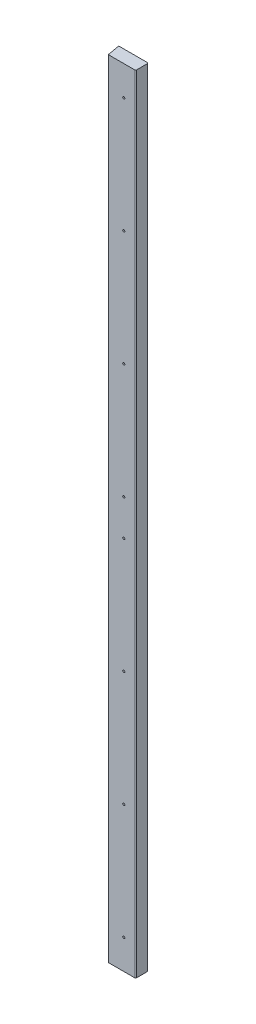
ISO-10303-21;
HEADER;
FILE_DESCRIPTION(('STEP AP214'),'2;1');
FILE_NAME('part.step','',(''),(''),'','','');
FILE_SCHEMA(('AUTOMOTIVE_DESIGN { 1 0 10303 214 1 1 1 1 }'));
ENDSEC;
DATA;
#1=APPLICATION_CONTEXT('core data for automotive mechanical design processes');
#2=APPLICATION_PROTOCOL_DEFINITION('international standard','automotive_design',2000,#1);
#3=PRODUCT_CONTEXT('',#1,'mechanical');
#4=PRODUCT('Part','Part','',(#3));
#5=PRODUCT_RELATED_PRODUCT_CATEGORY('part','',(#4));
#6=PRODUCT_DEFINITION_FORMATION('','',#4);
#7=PRODUCT_DEFINITION_CONTEXT('part definition',#1,'design');
#8=PRODUCT_DEFINITION('design','',#6,#7);
#9=PRODUCT_DEFINITION_SHAPE('','',#8);
#10=(LENGTH_UNIT() NAMED_UNIT(*) SI_UNIT(.MILLI.,.METRE.));
#11=(NAMED_UNIT(*) PLANE_ANGLE_UNIT() SI_UNIT($,.RADIAN.));
#12=(NAMED_UNIT(*) SI_UNIT($,.STERADIAN.) SOLID_ANGLE_UNIT());
#13=UNCERTAINTY_MEASURE_WITH_UNIT(LENGTH_MEASURE(1.E-05),#10,'distance_accuracy_value','');
#14=(GEOMETRIC_REPRESENTATION_CONTEXT(3) GLOBAL_UNCERTAINTY_ASSIGNED_CONTEXT((#13)) GLOBAL_UNIT_ASSIGNED_CONTEXT((#10,
#11,#12)) REPRESENTATION_CONTEXT('',''));
#15=CARTESIAN_POINT('',(0.,0.,0.));
#16=DIRECTION('',(0.,0.,1.));
#17=DIRECTION('',(1.,0.,0.));
#18=AXIS2_PLACEMENT_3D('',#15,#16,#17);
#19=CARTESIAN_POINT('',(44.45,2362.2,-19.05));
#20=DIRECTION('',(-1.,0.,0.));
#21=DIRECTION('',(0.,0.,1.));
#22=AXIS2_PLACEMENT_3D('',#19,#20,#21);
#23=PLANE('',#22);
#24=DIRECTION('',(0.,0.,-1.));
#25=VECTOR('',#24,1.);
#26=CARTESIAN_POINT('',(44.45,2362.2,-19.05));
#27=LINE('',#26,#25);
#28=CARTESIAN_POINT('',(44.45,2362.2,15.875));
#29=VERTEX_POINT('',#28);
#30=CARTESIAN_POINT('',(44.45,2362.2,-15.875));
#31=VERTEX_POINT('',#30);
#32=EDGE_CURVE('E94',#29,#31,#27,.T.);
#33=ORIENTED_EDGE('',*,*,#32,.F.);
#34=DIRECTION('',(0.,-1.,0.));
#35=VECTOR('',#34,1.);
#36=CARTESIAN_POINT('',(44.45,2362.2,15.875));
#37=LINE('',#36,#35);
#38=CARTESIAN_POINT('',(44.45,0.,15.875));
#39=VERTEX_POINT('',#38);
#40=EDGE_CURVE('E124',#29,#39,#37,.T.);
#41=ORIENTED_EDGE('',*,*,#40,.T.);
#42=DIRECTION('',(0.,0.,-1.));
#43=VECTOR('',#42,1.);
#44=CARTESIAN_POINT('',(44.45,0.,-19.05));
#45=LINE('',#44,#43);
#46=CARTESIAN_POINT('',(44.45,0.,-15.875));
#47=VERTEX_POINT('',#46);
#48=EDGE_CURVE('E113',#39,#47,#45,.T.);
#49=ORIENTED_EDGE('',*,*,#48,.T.);
#50=DIRECTION('',(0.,-1.,0.));
#51=VECTOR('',#50,1.);
#52=CARTESIAN_POINT('',(44.45,2362.2,-15.875));
#53=LINE('',#52,#51);
#54=EDGE_CURVE('E103',#47,#31,#53,.F.);
#55=ORIENTED_EDGE('',*,*,#54,.T.);
#56=EDGE_LOOP('',(#33,#41,#49,#55));
#57=FACE_BOUND('',#56,.T.);
#58=ADVANCED_FACE('F33',(#57),#23,.F.);
#59=CARTESIAN_POINT('',(44.45,2362.2,-19.05));
#60=DIRECTION('',(0.,0.,1.));
#61=DIRECTION('',(1.,0.,0.));
#62=AXIS2_PLACEMENT_3D('',#59,#60,#61);
#63=PLANE('',#62);
#64=CARTESIAN_POINT('',(8.81744416499271,2273.3,-19.05));
#65=DIRECTION('',(0.,0.,1.));
#66=DIRECTION('',(1.,0.,0.));
#67=AXIS2_PLACEMENT_3D('',#64,#65,#66);
#68=CIRCLE('',#67,3.17499999999998);
#69=CARTESIAN_POINT('',(11.9924441649927,2273.3,-19.05));
#70=VERTEX_POINT('',#69);
#71=EDGE_CURVE('E295',#70,#70,#68,.T.);
#72=ORIENTED_EDGE('',*,*,#71,.T.);
#73=EDGE_LOOP('',(#72));
#74=FACE_BOUND('',#73,.T.);
#75=CARTESIAN_POINT('',(8.81744416499392,1927.225,-19.05));
#76=DIRECTION('',(0.,0.,1.));
#77=DIRECTION('',(1.,0.,0.));
#78=AXIS2_PLACEMENT_3D('',#75,#76,#77);
#79=CIRCLE('',#78,3.17499999999998);
#80=CARTESIAN_POINT('',(11.9924441649939,1927.225,-19.05));
#81=VERTEX_POINT('',#80);
#82=EDGE_CURVE('E304',#81,#81,#79,.T.);
#83=ORIENTED_EDGE('',*,*,#82,.T.);
#84=EDGE_LOOP('',(#83));
#85=FACE_BOUND('',#84,.T.);
#86=CARTESIAN_POINT('',(8.81744416499512,1581.15,-19.05));
#87=DIRECTION('',(0.,0.,1.));
#88=DIRECTION('',(1.,0.,0.));
#89=AXIS2_PLACEMENT_3D('',#86,#87,#88);
#90=CIRCLE('',#89,3.17499999999998);
#91=CARTESIAN_POINT('',(11.9924441649951,1581.15,-19.05));
#92=VERTEX_POINT('',#91);
#93=EDGE_CURVE('E310',#92,#92,#90,.T.);
#94=ORIENTED_EDGE('',*,*,#93,.T.);
#95=EDGE_LOOP('',(#94));
#96=FACE_BOUND('',#95,.T.);
#97=CARTESIAN_POINT('',(8.81744416499633,1235.075,-19.05));
#98=DIRECTION('',(0.,0.,1.));
#99=DIRECTION('',(1.,0.,0.));
#100=AXIS2_PLACEMENT_3D('',#97,#98,#99);
#101=CIRCLE('',#100,3.17499999999998);
#102=CARTESIAN_POINT('',(11.9924441649963,1235.075,-19.05));
#103=VERTEX_POINT('',#102);
#104=EDGE_CURVE('E316',#103,#103,#101,.T.);
#105=ORIENTED_EDGE('',*,*,#104,.T.);
#106=EDGE_LOOP('',(#105));
#107=FACE_BOUND('',#106,.T.);
#108=CARTESIAN_POINT('',(8.81744416499271,88.9,-19.05));
#109=DIRECTION('',(0.,0.,1.));
#110=DIRECTION('',(1.,0.,0.));
#111=AXIS2_PLACEMENT_3D('',#108,#109,#110);
#112=CIRCLE('',#111,3.17499999999998);
#113=CARTESIAN_POINT('',(11.9924441649927,88.9,-19.05));
#114=VERTEX_POINT('',#113);
#115=EDGE_CURVE('E322',#114,#114,#112,.T.);
#116=ORIENTED_EDGE('',*,*,#115,.T.);
#117=EDGE_LOOP('',(#116));
#118=FACE_BOUND('',#117,.T.);
#119=CARTESIAN_POINT('',(8.81744416499392,434.975,-19.05));
#120=DIRECTION('',(0.,0.,1.));
#121=DIRECTION('',(1.,0.,0.));
#122=AXIS2_PLACEMENT_3D('',#119,#120,#121);
#123=CIRCLE('',#122,3.17499999999998);
#124=CARTESIAN_POINT('',(11.9924441649939,434.975,-19.05));
#125=VERTEX_POINT('',#124);
#126=EDGE_CURVE('E328',#125,#125,#123,.T.);
#127=ORIENTED_EDGE('',*,*,#126,.T.);
#128=EDGE_LOOP('',(#127));
#129=FACE_BOUND('',#128,.T.);
#130=CARTESIAN_POINT('',(8.81744416499512,781.05,-19.05));
#131=DIRECTION('',(0.,0.,1.));
#132=DIRECTION('',(1.,0.,0.));
#133=AXIS2_PLACEMENT_3D('',#130,#131,#132);
#134=CIRCLE('',#133,3.17499999999998);
#135=CARTESIAN_POINT('',(11.9924441649951,781.05,-19.05));
#136=VERTEX_POINT('',#135);
#137=EDGE_CURVE('E334',#136,#136,#134,.T.);
#138=ORIENTED_EDGE('',*,*,#137,.T.);
#139=EDGE_LOOP('',(#138));
#140=FACE_BOUND('',#139,.T.);
#141=CARTESIAN_POINT('',(8.81744416499633,1127.125,-19.05));
#142=DIRECTION('',(0.,0.,1.));
#143=DIRECTION('',(1.,0.,0.));
#144=AXIS2_PLACEMENT_3D('',#141,#142,#143);
#145=CIRCLE('',#144,3.17499999999998);
#146=CARTESIAN_POINT('',(11.9924441649963,1127.125,-19.05));
#147=VERTEX_POINT('',#146);
#148=EDGE_CURVE('E116',#147,#147,#145,.T.);
#149=ORIENTED_EDGE('',*,*,#148,.T.);
#150=EDGE_LOOP('',(#149));
#151=FACE_BOUND('',#150,.T.);
#152=DIRECTION('',(-1.,0.,0.));
#153=VECTOR('',#152,1.);
#154=CARTESIAN_POINT('',(44.45,2362.2,-19.05));
#155=LINE('',#154,#153);
#156=CARTESIAN_POINT('',(41.275,2362.2,-19.05));
#157=VERTEX_POINT('',#156);
#158=CARTESIAN_POINT('',(-44.45,2362.2,-19.05));
#159=VERTEX_POINT('',#158);
#160=EDGE_CURVE('E86',#157,#159,#155,.T.);
#161=ORIENTED_EDGE('',*,*,#160,.F.);
#162=DIRECTION('',(0.,-1.,0.));
#163=VECTOR('',#162,1.);
#164=CARTESIAN_POINT('',(41.275,2362.2,-19.05));
#165=LINE('',#164,#163);
#166=CARTESIAN_POINT('',(41.275,0.,-19.05));
#167=VERTEX_POINT('',#166);
#168=EDGE_CURVE('E11',#157,#167,#165,.T.);
#169=ORIENTED_EDGE('',*,*,#168,.T.);
#170=DIRECTION('',(-1.,0.,0.));
#171=VECTOR('',#170,1.);
#172=CARTESIAN_POINT('',(44.45,0.,-19.05));
#173=LINE('',#172,#171);
#174=CARTESIAN_POINT('',(-44.45,0.,-19.05));
#175=VERTEX_POINT('',#174);
#176=EDGE_CURVE('E100',#167,#175,#173,.T.);
#177=ORIENTED_EDGE('',*,*,#176,.T.);
#178=DIRECTION('',(0.,-1.,0.));
#179=VECTOR('',#178,1.);
#180=CARTESIAN_POINT('',(-44.45,2362.2,-19.05));
#181=LINE('',#180,#179);
#182=EDGE_CURVE('E97',#159,#175,#181,.T.);
#183=ORIENTED_EDGE('',*,*,#182,.F.);
#184=EDGE_LOOP('',(#161,#169,#177,#183));
#185=FACE_BOUND('',#184,.T.);
#186=ADVANCED_FACE('F98',(#74,#85,#96,#107,#118,#129,#140,#151,#185),#63,.F.);
#187=CARTESIAN_POINT('',(-44.45,2362.2,-19.05));
#188=DIRECTION('',(0.984807753012207,0.,-0.173648177666935));
#189=DIRECTION('',(-0.173648177666935,0.,-0.984807753012207));
#190=AXIS2_PLACEMENT_3D('',#187,#188,#189);
#191=PLANE('',#190);
#192=DIRECTION('',(0.173648177666935,0.,0.984807753012207));
#193=VECTOR('',#192,1.);
#194=CARTESIAN_POINT('',(-44.45,0.,-19.05));
#195=LINE('',#194,#193);
#196=CARTESIAN_POINT('',(-37.7319420350073,0.,19.05));
#197=VERTEX_POINT('',#196);
#198=EDGE_CURVE('E118',#175,#197,#195,.T.);
#199=ORIENTED_EDGE('',*,*,#198,.T.);
#200=DIRECTION('',(0.,-1.,0.));
#201=VECTOR('',#200,1.);
#202=CARTESIAN_POINT('',(-37.7319420350073,2362.2,19.05));
#203=LINE('',#202,#201);
#204=CARTESIAN_POINT('',(-37.7319420350073,2362.2,19.05));
#205=VERTEX_POINT('',#204);
#206=EDGE_CURVE('E104',#205,#197,#203,.T.);
#207=ORIENTED_EDGE('',*,*,#206,.F.);
#208=DIRECTION('',(0.173648177666935,0.,0.984807753012207));
#209=VECTOR('',#208,1.);
#210=CARTESIAN_POINT('',(-44.45,2362.2,-19.05));
#211=LINE('',#210,#209);
#212=EDGE_CURVE('E90',#159,#205,#211,.T.);
#213=ORIENTED_EDGE('',*,*,#212,.F.);
#214=ORIENTED_EDGE('',*,*,#182,.T.);
#215=EDGE_LOOP('',(#199,#207,#213,#214));
#216=FACE_BOUND('',#215,.T.);
#217=ADVANCED_FACE('F106',(#216),#191,.F.);
#218=CARTESIAN_POINT('',(44.45,2362.2,19.05));
#219=DIRECTION('',(0.,0.,-1.));
#220=DIRECTION('',(-1.,0.,0.));
#221=AXIS2_PLACEMENT_3D('',#218,#219,#220);
#222=PLANE('',#221);
#223=CARTESIAN_POINT('',(8.81744416499271,2273.3,19.05));
#224=DIRECTION('',(0.,0.,1.));
#225=DIRECTION('',(1.,0.,0.));
#226=AXIS2_PLACEMENT_3D('',#223,#224,#225);
#227=CIRCLE('',#226,3.17499999999999);
#228=CARTESIAN_POINT('',(11.9924441649927,2273.3,19.05));
#229=VERTEX_POINT('',#228);
#230=EDGE_CURVE('E297',#229,#229,#227,.T.);
#231=ORIENTED_EDGE('',*,*,#230,.F.);
#232=EDGE_LOOP('',(#231));
#233=FACE_BOUND('',#232,.T.);
#234=CARTESIAN_POINT('',(8.81744416499392,1927.225,19.05));
#235=DIRECTION('',(0.,0.,1.));
#236=DIRECTION('',(1.,0.,0.));
#237=AXIS2_PLACEMENT_3D('',#234,#235,#236);
#238=CIRCLE('',#237,3.17499999999999);
#239=CARTESIAN_POINT('',(11.9924441649939,1927.225,19.05));
#240=VERTEX_POINT('',#239);
#241=EDGE_CURVE('E299',#240,#240,#238,.T.);
#242=ORIENTED_EDGE('',*,*,#241,.F.);
#243=EDGE_LOOP('',(#242));
#244=FACE_BOUND('',#243,.T.);
#245=CARTESIAN_POINT('',(8.81744416499512,1581.15,19.05));
#246=DIRECTION('',(0.,0.,1.));
#247=DIRECTION('',(1.,0.,0.));
#248=AXIS2_PLACEMENT_3D('',#245,#246,#247);
#249=CIRCLE('',#248,3.17499999999999);
#250=CARTESIAN_POINT('',(11.9924441649951,1581.15,19.05));
#251=VERTEX_POINT('',#250);
#252=EDGE_CURVE('E307',#251,#251,#249,.T.);
#253=ORIENTED_EDGE('',*,*,#252,.F.);
#254=EDGE_LOOP('',(#253));
#255=FACE_BOUND('',#254,.T.);
#256=CARTESIAN_POINT('',(8.81744416499633,1235.075,19.05));
#257=DIRECTION('',(0.,0.,1.));
#258=DIRECTION('',(1.,0.,0.));
#259=AXIS2_PLACEMENT_3D('',#256,#257,#258);
#260=CIRCLE('',#259,3.17499999999999);
#261=CARTESIAN_POINT('',(11.9924441649963,1235.075,19.05));
#262=VERTEX_POINT('',#261);
#263=EDGE_CURVE('E313',#262,#262,#260,.T.);
#264=ORIENTED_EDGE('',*,*,#263,.F.);
#265=EDGE_LOOP('',(#264));
#266=FACE_BOUND('',#265,.T.);
#267=CARTESIAN_POINT('',(8.81744416499271,88.9,19.05));
#268=DIRECTION('',(0.,0.,1.));
#269=DIRECTION('',(1.,0.,0.));
#270=AXIS2_PLACEMENT_3D('',#267,#268,#269);
#271=CIRCLE('',#270,3.17499999999999);
#272=CARTESIAN_POINT('',(11.9924441649927,88.9,19.05));
#273=VERTEX_POINT('',#272);
#274=EDGE_CURVE('E319',#273,#273,#271,.T.);
#275=ORIENTED_EDGE('',*,*,#274,.F.);
#276=EDGE_LOOP('',(#275));
#277=FACE_BOUND('',#276,.T.);
#278=CARTESIAN_POINT('',(8.81744416499392,434.975,19.05));
#279=DIRECTION('',(0.,0.,1.));
#280=DIRECTION('',(1.,0.,0.));
#281=AXIS2_PLACEMENT_3D('',#278,#279,#280);
#282=CIRCLE('',#281,3.17499999999999);
#283=CARTESIAN_POINT('',(11.9924441649939,434.975,19.05));
#284=VERTEX_POINT('',#283);
#285=EDGE_CURVE('E325',#284,#284,#282,.T.);
#286=ORIENTED_EDGE('',*,*,#285,.F.);
#287=EDGE_LOOP('',(#286));
#288=FACE_BOUND('',#287,.T.);
#289=CARTESIAN_POINT('',(8.81744416499512,781.05,19.05));
#290=DIRECTION('',(0.,0.,1.));
#291=DIRECTION('',(1.,0.,0.));
#292=AXIS2_PLACEMENT_3D('',#289,#290,#291);
#293=CIRCLE('',#292,3.17499999999999);
#294=CARTESIAN_POINT('',(11.9924441649951,781.05,19.05));
#295=VERTEX_POINT('',#294);
#296=EDGE_CURVE('E331',#295,#295,#293,.T.);
#297=ORIENTED_EDGE('',*,*,#296,.F.);
#298=EDGE_LOOP('',(#297));
#299=FACE_BOUND('',#298,.T.);
#300=CARTESIAN_POINT('',(8.81744416499633,1127.125,19.05));
#301=DIRECTION('',(0.,0.,1.));
#302=DIRECTION('',(1.,0.,0.));
#303=AXIS2_PLACEMENT_3D('',#300,#301,#302);
#304=CIRCLE('',#303,3.17499999999999);
#305=CARTESIAN_POINT('',(11.9924441649963,1127.125,19.05));
#306=VERTEX_POINT('',#305);
#307=EDGE_CURVE('E337',#306,#306,#304,.T.);
#308=ORIENTED_EDGE('',*,*,#307,.F.);
#309=EDGE_LOOP('',(#308));
#310=FACE_BOUND('',#309,.T.);
#311=DIRECTION('',(1.,0.,0.));
#312=VECTOR('',#311,1.);
#313=CARTESIAN_POINT('',(44.45,0.,19.05));
#314=LINE('',#313,#312);
#315=CARTESIAN_POINT('',(41.275,0.,19.05));
#316=VERTEX_POINT('',#315);
#317=EDGE_CURVE('E120',#197,#316,#314,.T.);
#318=ORIENTED_EDGE('',*,*,#317,.T.);
#319=DIRECTION('',(0.,-1.,0.));
#320=VECTOR('',#319,1.);
#321=CARTESIAN_POINT('',(41.275,2362.2,19.05));
#322=LINE('',#321,#320);
#323=CARTESIAN_POINT('',(41.275,2362.2,19.05));
#324=VERTEX_POINT('',#323);
#325=EDGE_CURVE('E56',#316,#324,#322,.F.);
#326=ORIENTED_EDGE('',*,*,#325,.T.);
#327=DIRECTION('',(1.,0.,0.));
#328=VECTOR('',#327,1.);
#329=CARTESIAN_POINT('',(44.45,2362.2,19.05));
#330=LINE('',#329,#328);
#331=EDGE_CURVE('E108',#205,#324,#330,.T.);
#332=ORIENTED_EDGE('',*,*,#331,.F.);
#333=ORIENTED_EDGE('',*,*,#206,.T.);
#334=EDGE_LOOP('',(#318,#326,#332,#333));
#335=FACE_BOUND('',#334,.T.);
#336=ADVANCED_FACE('F143',(#233,#244,#255,#266,#277,#288,#299,#310,#335),#222,.F.);
#337=CARTESIAN_POINT('',(0.,2362.2,0.));
#338=DIRECTION('',(0.,-1.,0.));
#339=DIRECTION('',(0.,0.,-1.));
#340=AXIS2_PLACEMENT_3D('',#337,#338,#339);
#341=PLANE('',#340);
#342=ORIENTED_EDGE('',*,*,#331,.T.);
#343=CARTESIAN_POINT('',(41.275,2362.2,15.875));
#344=DIRECTION('',(0.,-1.,0.));
#345=DIRECTION('',(0.,0.,-1.));
#346=AXIS2_PLACEMENT_3D('',#343,#344,#345);
#347=CIRCLE('',#346,3.175);
#348=EDGE_CURVE('E41',#324,#29,#347,.F.);
#349=ORIENTED_EDGE('',*,*,#348,.T.);
#350=ORIENTED_EDGE('',*,*,#32,.T.);
#351=CARTESIAN_POINT('',(41.275,2362.2,-15.875));
#352=DIRECTION('',(0.,-1.,0.));
#353=DIRECTION('',(0.,0.,-1.));
#354=AXIS2_PLACEMENT_3D('',#351,#352,#353);
#355=CIRCLE('',#354,3.175);
#356=EDGE_CURVE('E48',#31,#157,#355,.F.);
#357=ORIENTED_EDGE('',*,*,#356,.T.);
#358=ORIENTED_EDGE('',*,*,#160,.T.);
#359=ORIENTED_EDGE('',*,*,#212,.T.);
#360=EDGE_LOOP('',(#342,#349,#350,#357,#358,#359));
#361=FACE_BOUND('',#360,.T.);
#362=ADVANCED_FACE('F88',(#361),#341,.F.);
#363=CARTESIAN_POINT('',(0.,0.,0.));
#364=DIRECTION('',(0.,-1.,0.));
#365=DIRECTION('',(0.,0.,-1.));
#366=AXIS2_PLACEMENT_3D('',#363,#364,#365);
#367=PLANE('',#366);
#368=ORIENTED_EDGE('',*,*,#48,.F.);
#369=CARTESIAN_POINT('',(41.275,0.,15.875));
#370=DIRECTION('',(0.,-1.,0.));
#371=DIRECTION('',(0.,0.,-1.));
#372=AXIS2_PLACEMENT_3D('',#369,#370,#371);
#373=CIRCLE('',#372,3.175);
#374=EDGE_CURVE('E129',#39,#316,#373,.T.);
#375=ORIENTED_EDGE('',*,*,#374,.T.);
#376=ORIENTED_EDGE('',*,*,#317,.F.);
#377=ORIENTED_EDGE('',*,*,#198,.F.);
#378=ORIENTED_EDGE('',*,*,#176,.F.);
#379=CARTESIAN_POINT('',(41.275,0.,-15.875));
#380=DIRECTION('',(0.,-1.,0.));
#381=DIRECTION('',(0.,0.,-1.));
#382=AXIS2_PLACEMENT_3D('',#379,#380,#381);
#383=CIRCLE('',#382,3.175);
#384=EDGE_CURVE('E127',#167,#47,#383,.T.);
#385=ORIENTED_EDGE('',*,*,#384,.T.);
#386=EDGE_LOOP('',(#368,#375,#376,#377,#378,#385));
#387=FACE_BOUND('',#386,.T.);
#388=ADVANCED_FACE('F142',(#387),#367,.T.);
#389=CARTESIAN_POINT('',(8.81744416499633,1127.125,19.05));
#390=DIRECTION('',(0.,0.,1.));
#391=DIRECTION('',(1.,0.,0.));
#392=AXIS2_PLACEMENT_3D('',#389,#390,#391);
#393=CYLINDRICAL_SURFACE('',#392,3.17499999999999);
#394=ORIENTED_EDGE('',*,*,#148,.F.);
#395=EDGE_LOOP('',(#394));
#396=FACE_BOUND('',#395,.T.);
#397=ORIENTED_EDGE('',*,*,#307,.T.);
#398=EDGE_LOOP('',(#397));
#399=FACE_BOUND('',#398,.T.);
#400=ADVANCED_FACE('F187',(#396,#399),#393,.F.);
#401=CARTESIAN_POINT('',(8.81744416499512,781.05,19.05));
#402=DIRECTION('',(0.,0.,1.));
#403=DIRECTION('',(1.,0.,0.));
#404=AXIS2_PLACEMENT_3D('',#401,#402,#403);
#405=CYLINDRICAL_SURFACE('',#404,3.17499999999999);
#406=ORIENTED_EDGE('',*,*,#137,.F.);
#407=EDGE_LOOP('',(#406));
#408=FACE_BOUND('',#407,.T.);
#409=ORIENTED_EDGE('',*,*,#296,.T.);
#410=EDGE_LOOP('',(#409));
#411=FACE_BOUND('',#410,.T.);
#412=ADVANCED_FACE('F177',(#408,#411),#405,.F.);
#413=CARTESIAN_POINT('',(8.81744416499392,434.975,19.05));
#414=DIRECTION('',(0.,0.,1.));
#415=DIRECTION('',(1.,0.,0.));
#416=AXIS2_PLACEMENT_3D('',#413,#414,#415);
#417=CYLINDRICAL_SURFACE('',#416,3.17499999999999);
#418=ORIENTED_EDGE('',*,*,#126,.F.);
#419=EDGE_LOOP('',(#418));
#420=FACE_BOUND('',#419,.T.);
#421=ORIENTED_EDGE('',*,*,#285,.T.);
#422=EDGE_LOOP('',(#421));
#423=FACE_BOUND('',#422,.T.);
#424=ADVANCED_FACE('F171',(#420,#423),#417,.F.);
#425=CARTESIAN_POINT('',(8.81744416499271,88.9,19.05));
#426=DIRECTION('',(0.,0.,1.));
#427=DIRECTION('',(1.,0.,0.));
#428=AXIS2_PLACEMENT_3D('',#425,#426,#427);
#429=CYLINDRICAL_SURFACE('',#428,3.17499999999999);
#430=ORIENTED_EDGE('',*,*,#115,.F.);
#431=EDGE_LOOP('',(#430));
#432=FACE_BOUND('',#431,.T.);
#433=ORIENTED_EDGE('',*,*,#274,.T.);
#434=EDGE_LOOP('',(#433));
#435=FACE_BOUND('',#434,.T.);
#436=ADVANCED_FACE('F164',(#432,#435),#429,.F.);
#437=CARTESIAN_POINT('',(41.275,2362.2,15.875));
#438=DIRECTION('',(0.,-1.,0.));
#439=DIRECTION('',(0.,0.,-1.));
#440=AXIS2_PLACEMENT_3D('',#437,#438,#439);
#441=CYLINDRICAL_SURFACE('',#440,3.175);
#442=ORIENTED_EDGE('',*,*,#348,.F.);
#443=ORIENTED_EDGE('',*,*,#325,.F.);
#444=ORIENTED_EDGE('',*,*,#374,.F.);
#445=ORIENTED_EDGE('',*,*,#40,.F.);
#446=EDGE_LOOP('',(#442,#443,#444,#445));
#447=FACE_BOUND('',#446,.T.);
#448=ADVANCED_FACE('F139',(#447),#441,.T.);
#449=CARTESIAN_POINT('',(41.275,2362.2,-15.875));
#450=DIRECTION('',(0.,-1.,0.));
#451=DIRECTION('',(0.,0.,-1.));
#452=AXIS2_PLACEMENT_3D('',#449,#450,#451);
#453=CYLINDRICAL_SURFACE('',#452,3.175);
#454=ORIENTED_EDGE('',*,*,#356,.F.);
#455=ORIENTED_EDGE('',*,*,#54,.F.);
#456=ORIENTED_EDGE('',*,*,#384,.F.);
#457=ORIENTED_EDGE('',*,*,#168,.F.);
#458=EDGE_LOOP('',(#454,#455,#456,#457));
#459=FACE_BOUND('',#458,.T.);
#460=ADVANCED_FACE('F35',(#459),#453,.T.);
#461=CARTESIAN_POINT('',(8.81744416499633,1235.075,19.05));
#462=DIRECTION('',(0.,0.,1.));
#463=DIRECTION('',(1.,0.,0.));
#464=AXIS2_PLACEMENT_3D('',#461,#462,#463);
#465=CYLINDRICAL_SURFACE('',#464,3.17499999999999);
#466=ORIENTED_EDGE('',*,*,#104,.F.);
#467=EDGE_LOOP('',(#466));
#468=FACE_BOUND('',#467,.T.);
#469=ORIENTED_EDGE('',*,*,#263,.T.);
#470=EDGE_LOOP('',(#469));
#471=FACE_BOUND('',#470,.T.);
#472=ADVANCED_FACE('F169',(#468,#471),#465,.F.);
#473=CARTESIAN_POINT('',(8.81744416499512,1581.15,19.05));
#474=DIRECTION('',(0.,0.,1.));
#475=DIRECTION('',(1.,0.,0.));
#476=AXIS2_PLACEMENT_3D('',#473,#474,#475);
#477=CYLINDRICAL_SURFACE('',#476,3.17499999999999);
#478=ORIENTED_EDGE('',*,*,#93,.F.);
#479=EDGE_LOOP('',(#478));
#480=FACE_BOUND('',#479,.T.);
#481=ORIENTED_EDGE('',*,*,#252,.T.);
#482=EDGE_LOOP('',(#481));
#483=FACE_BOUND('',#482,.T.);
#484=ADVANCED_FACE('F260',(#480,#483),#477,.F.);
#485=CARTESIAN_POINT('',(8.81744416499392,1927.225,19.05));
#486=DIRECTION('',(0.,0.,1.));
#487=DIRECTION('',(1.,0.,0.));
#488=AXIS2_PLACEMENT_3D('',#485,#486,#487);
#489=CYLINDRICAL_SURFACE('',#488,3.17499999999999);
#490=ORIENTED_EDGE('',*,*,#82,.F.);
#491=EDGE_LOOP('',(#490));
#492=FACE_BOUND('',#491,.T.);
#493=ORIENTED_EDGE('',*,*,#241,.T.);
#494=EDGE_LOOP('',(#493));
#495=FACE_BOUND('',#494,.T.);
#496=ADVANCED_FACE('F266',(#492,#495),#489,.F.);
#497=CARTESIAN_POINT('',(8.81744416499271,2273.3,19.05));
#498=DIRECTION('',(0.,0.,1.));
#499=DIRECTION('',(1.,0.,0.));
#500=AXIS2_PLACEMENT_3D('',#497,#498,#499);
#501=CYLINDRICAL_SURFACE('',#500,3.17499999999999);
#502=ORIENTED_EDGE('',*,*,#71,.F.);
#503=EDGE_LOOP('',(#502));
#504=FACE_BOUND('',#503,.T.);
#505=ORIENTED_EDGE('',*,*,#230,.T.);
#506=EDGE_LOOP('',(#505));
#507=FACE_BOUND('',#506,.T.);
#508=ADVANCED_FACE('F273',(#504,#507),#501,.F.);
#509=CLOSED_SHELL('',(#58,#186,#217,#336,#362,#388,#400,#412,#424,#436,#448,#460,#472,#484,#496,#508));
#510=MANIFOLD_SOLID_BREP('B2',#509);
#511=ADVANCED_BREP_SHAPE_REPRESENTATION('',(#18,#510),#14);
#512=SHAPE_DEFINITION_REPRESENTATION(#9,#511);
ENDSEC;
END-ISO-10303-21;
